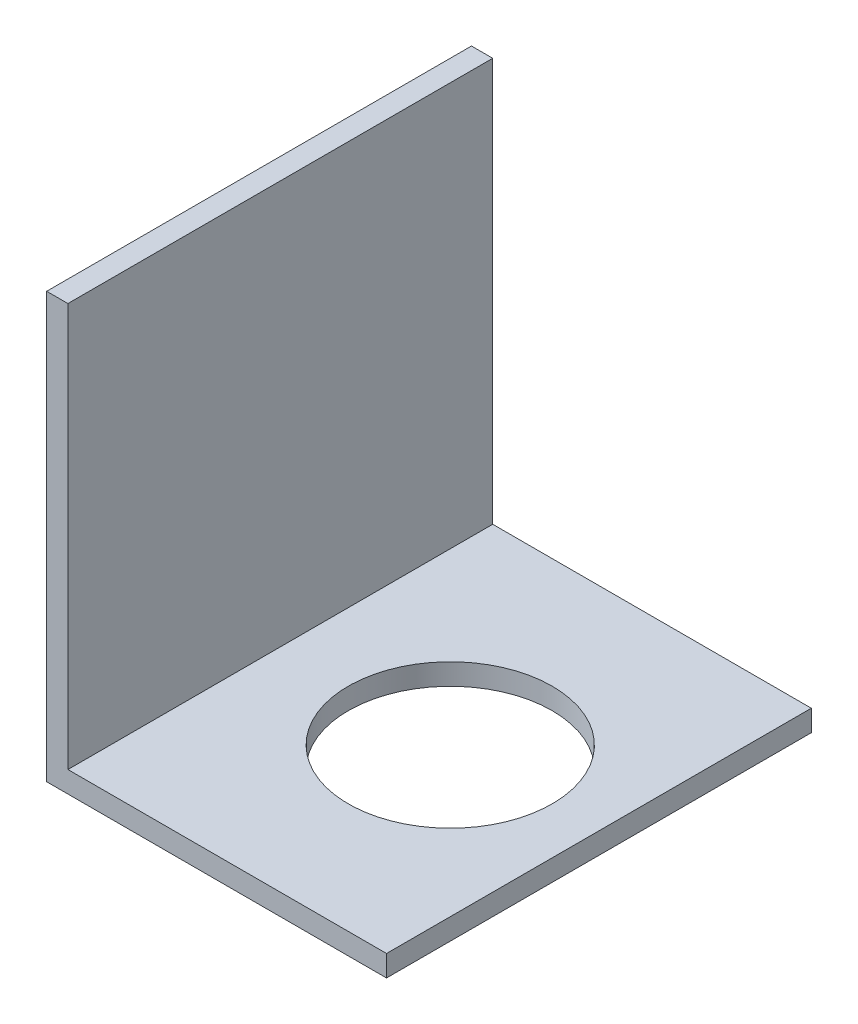
ISO-10303-21;
HEADER;
FILE_DESCRIPTION(('STEP AP214'),'2;1');
FILE_NAME('part.step','',(''),(''),'','','');
FILE_SCHEMA(('AUTOMOTIVE_DESIGN { 1 0 10303 214 1 1 1 1 }'));
ENDSEC;
DATA;
#1=APPLICATION_CONTEXT('core data for automotive mechanical design processes');
#2=APPLICATION_PROTOCOL_DEFINITION('international standard','automotive_design',2000,#1);
#3=PRODUCT_CONTEXT('',#1,'mechanical');
#4=PRODUCT('Part','Part','',(#3));
#5=PRODUCT_RELATED_PRODUCT_CATEGORY('part','',(#4));
#6=PRODUCT_DEFINITION_FORMATION('','',#4);
#7=PRODUCT_DEFINITION_CONTEXT('part definition',#1,'design');
#8=PRODUCT_DEFINITION('design','',#6,#7);
#9=PRODUCT_DEFINITION_SHAPE('','',#8);
#10=(LENGTH_UNIT() NAMED_UNIT(*) SI_UNIT(.MILLI.,.METRE.));
#11=(NAMED_UNIT(*) PLANE_ANGLE_UNIT() SI_UNIT($,.RADIAN.));
#12=(NAMED_UNIT(*) SI_UNIT($,.STERADIAN.) SOLID_ANGLE_UNIT());
#13=UNCERTAINTY_MEASURE_WITH_UNIT(LENGTH_MEASURE(1.E-05),#10,'distance_accuracy_value','');
#14=(GEOMETRIC_REPRESENTATION_CONTEXT(3) GLOBAL_UNCERTAINTY_ASSIGNED_CONTEXT((#13)) GLOBAL_UNIT_ASSIGNED_CONTEXT((#10,
#11,#12)) REPRESENTATION_CONTEXT('',''));
#15=CARTESIAN_POINT('',(0.,0.,0.));
#16=DIRECTION('',(0.,0.,1.));
#17=DIRECTION('',(1.,0.,0.));
#18=AXIS2_PLACEMENT_3D('',#15,#16,#17);
#19=CARTESIAN_POINT('',(45.,5.,0.));
#20=DIRECTION('',(0.,-1.,0.));
#21=DIRECTION('',(0.,0.,-1.));
#22=AXIS2_PLACEMENT_3D('',#19,#20,#21);
#23=CYLINDRICAL_SURFACE('',#22,24.);
#24=CARTESIAN_POINT('',(45.,5.,0.));
#25=DIRECTION('',(0.,-1.,0.));
#26=DIRECTION('',(0.,0.,-1.));
#27=AXIS2_PLACEMENT_3D('',#24,#25,#26);
#28=CIRCLE('',#27,24.);
#29=CARTESIAN_POINT('',(45.,5.,-24.));
#30=VERTEX_POINT('',#29);
#31=EDGE_CURVE('E20',#30,#30,#28,.T.);
#32=ORIENTED_EDGE('',*,*,#31,.F.);
#33=EDGE_LOOP('',(#32));
#34=FACE_BOUND('',#33,.T.);
#35=CARTESIAN_POINT('',(45.,0.,0.));
#36=DIRECTION('',(0.,-1.,0.));
#37=DIRECTION('',(0.,0.,-1.));
#38=AXIS2_PLACEMENT_3D('',#35,#36,#37);
#39=CIRCLE('',#38,24.);
#40=CARTESIAN_POINT('',(45.,0.,-24.));
#41=VERTEX_POINT('',#40);
#42=EDGE_CURVE('E81',#41,#41,#39,.F.);
#43=ORIENTED_EDGE('',*,*,#42,.F.);
#44=EDGE_LOOP('',(#43));
#45=FACE_BOUND('',#44,.T.);
#46=ADVANCED_FACE('F17',(#34,#45),#23,.F.);
#47=CARTESIAN_POINT('',(80.,0.,-50.));
#48=DIRECTION('',(1.,0.,0.));
#49=DIRECTION('',(0.,0.,-1.));
#50=AXIS2_PLACEMENT_3D('',#47,#48,#49);
#51=PLANE('',#50);
#52=DIRECTION('',(0.,0.,-1.));
#53=VECTOR('',#52,1.);
#54=CARTESIAN_POINT('',(80.,0.,-50.));
#55=LINE('',#54,#53);
#56=CARTESIAN_POINT('',(80.,0.,-50.));
#57=VERTEX_POINT('',#56);
#58=CARTESIAN_POINT('',(80.,0.,50.));
#59=VERTEX_POINT('',#58);
#60=EDGE_CURVE('E73',#57,#59,#55,.F.);
#61=ORIENTED_EDGE('',*,*,#60,.F.);
#62=DIRECTION('',(0.,1.,0.));
#63=VECTOR('',#62,1.);
#64=CARTESIAN_POINT('',(80.,0.,-50.));
#65=LINE('',#64,#63);
#66=CARTESIAN_POINT('',(80.,5.,-50.));
#67=VERTEX_POINT('',#66);
#68=EDGE_CURVE('E155',#57,#67,#65,.T.);
#69=ORIENTED_EDGE('',*,*,#68,.T.);
#70=DIRECTION('',(0.,0.,1.));
#71=VECTOR('',#70,1.);
#72=CARTESIAN_POINT('',(80.,5.,-50.));
#73=LINE('',#72,#71);
#74=CARTESIAN_POINT('',(80.,5.,50.));
#75=VERTEX_POINT('',#74);
#76=EDGE_CURVE('E68',#75,#67,#73,.F.);
#77=ORIENTED_EDGE('',*,*,#76,.F.);
#78=DIRECTION('',(0.,1.,0.));
#79=VECTOR('',#78,1.);
#80=CARTESIAN_POINT('',(80.,0.,50.));
#81=LINE('',#80,#79);
#82=EDGE_CURVE('E85',#59,#75,#81,.T.);
#83=ORIENTED_EDGE('',*,*,#82,.F.);
#84=EDGE_LOOP('',(#61,#69,#77,#83));
#85=FACE_BOUND('',#84,.T.);
#86=ADVANCED_FACE('F86',(#85),#51,.T.);
#87=CARTESIAN_POINT('',(80.,5.,-50.));
#88=DIRECTION('',(0.,1.,0.));
#89=DIRECTION('',(0.,0.,1.));
#90=AXIS2_PLACEMENT_3D('',#87,#88,#89);
#91=PLANE('',#90);
#92=ORIENTED_EDGE('',*,*,#31,.T.);
#93=EDGE_LOOP('',(#92));
#94=FACE_BOUND('',#93,.T.);
#95=ORIENTED_EDGE('',*,*,#76,.T.);
#96=DIRECTION('',(1.,0.,0.));
#97=VECTOR('',#96,1.);
#98=CARTESIAN_POINT('',(0.,5.,-50.));
#99=LINE('',#98,#97);
#100=CARTESIAN_POINT('',(5.,5.,-50.));
#101=VERTEX_POINT('',#100);
#102=EDGE_CURVE('E150',#67,#101,#99,.F.);
#103=ORIENTED_EDGE('',*,*,#102,.T.);
#104=DIRECTION('',(0.,0.,-1.));
#105=VECTOR('',#104,1.);
#106=CARTESIAN_POINT('',(5.,5.,-50.));
#107=LINE('',#106,#105);
#108=CARTESIAN_POINT('',(5.,5.,50.));
#109=VERTEX_POINT('',#108);
#110=EDGE_CURVE('E82',#109,#101,#107,.T.);
#111=ORIENTED_EDGE('',*,*,#110,.F.);
#112=DIRECTION('',(1.,0.,0.));
#113=VECTOR('',#112,1.);
#114=CARTESIAN_POINT('',(0.,5.,50.));
#115=LINE('',#114,#113);
#116=EDGE_CURVE('E89',#75,#109,#115,.F.);
#117=ORIENTED_EDGE('',*,*,#116,.F.);
#118=EDGE_LOOP('',(#95,#103,#111,#117));
#119=FACE_BOUND('',#118,.T.);
#120=ADVANCED_FACE('F106',(#94,#119),#91,.T.);
#121=CARTESIAN_POINT('',(5.,5.,-50.));
#122=DIRECTION('',(1.,0.,0.));
#123=DIRECTION('',(0.,0.,-1.));
#124=AXIS2_PLACEMENT_3D('',#121,#122,#123);
#125=PLANE('',#124);
#126=ORIENTED_EDGE('',*,*,#110,.T.);
#127=DIRECTION('',(0.,1.,0.));
#128=VECTOR('',#127,1.);
#129=CARTESIAN_POINT('',(5.,0.,-50.));
#130=LINE('',#129,#128);
#131=CARTESIAN_POINT('',(5.,100.,-50.));
#132=VERTEX_POINT('',#131);
#133=EDGE_CURVE('E146',#101,#132,#130,.T.);
#134=ORIENTED_EDGE('',*,*,#133,.T.);
#135=DIRECTION('',(0.,0.,1.));
#136=VECTOR('',#135,1.);
#137=CARTESIAN_POINT('',(5.,100.,-50.));
#138=LINE('',#137,#136);
#139=CARTESIAN_POINT('',(5.,100.,50.));
#140=VERTEX_POINT('',#139);
#141=EDGE_CURVE('E141',#140,#132,#138,.F.);
#142=ORIENTED_EDGE('',*,*,#141,.F.);
#143=DIRECTION('',(0.,1.,0.));
#144=VECTOR('',#143,1.);
#145=CARTESIAN_POINT('',(5.,0.,50.));
#146=LINE('',#145,#144);
#147=EDGE_CURVE('E159',#109,#140,#146,.T.);
#148=ORIENTED_EDGE('',*,*,#147,.F.);
#149=EDGE_LOOP('',(#126,#134,#142,#148));
#150=FACE_BOUND('',#149,.T.);
#151=ADVANCED_FACE('F113',(#150),#125,.T.);
#152=CARTESIAN_POINT('',(0.,0.,-50.));
#153=DIRECTION('',(0.,-1.,0.));
#154=DIRECTION('',(0.,0.,-1.));
#155=AXIS2_PLACEMENT_3D('',#152,#153,#154);
#156=PLANE('',#155);
#157=ORIENTED_EDGE('',*,*,#42,.T.);
#158=EDGE_LOOP('',(#157));
#159=FACE_BOUND('',#158,.T.);
#160=DIRECTION('',(0.,0.,1.));
#161=VECTOR('',#160,1.);
#162=CARTESIAN_POINT('',(0.,0.,-50.));
#163=LINE('',#162,#161);
#164=CARTESIAN_POINT('',(0.,0.,-50.));
#165=VERTEX_POINT('',#164);
#166=CARTESIAN_POINT('',(0.,0.,50.));
#167=VERTEX_POINT('',#166);
#168=EDGE_CURVE('E147',#165,#167,#163,.T.);
#169=ORIENTED_EDGE('',*,*,#168,.F.);
#170=DIRECTION('',(1.,0.,0.));
#171=VECTOR('',#170,1.);
#172=CARTESIAN_POINT('',(0.,0.,-50.));
#173=LINE('',#172,#171);
#174=EDGE_CURVE('E79',#165,#57,#173,.T.);
#175=ORIENTED_EDGE('',*,*,#174,.T.);
#176=ORIENTED_EDGE('',*,*,#60,.T.);
#177=DIRECTION('',(1.,0.,0.));
#178=VECTOR('',#177,1.);
#179=CARTESIAN_POINT('',(0.,0.,50.));
#180=LINE('',#179,#178);
#181=EDGE_CURVE('E76',#167,#59,#180,.T.);
#182=ORIENTED_EDGE('',*,*,#181,.F.);
#183=EDGE_LOOP('',(#169,#175,#176,#182));
#184=FACE_BOUND('',#183,.T.);
#185=ADVANCED_FACE('F74',(#159,#184),#156,.T.);
#186=CARTESIAN_POINT('',(0.,0.,50.));
#187=DIRECTION('',(0.,0.,1.));
#188=DIRECTION('',(1.,0.,0.));
#189=AXIS2_PLACEMENT_3D('',#186,#187,#188);
#190=PLANE('',#189);
#191=DIRECTION('',(1.,0.,0.));
#192=VECTOR('',#191,1.);
#193=CARTESIAN_POINT('',(5.,100.,50.));
#194=LINE('',#193,#192);
#195=CARTESIAN_POINT('',(0.,100.,50.));
#196=VERTEX_POINT('',#195);
#197=EDGE_CURVE('E142',#196,#140,#194,.T.);
#198=ORIENTED_EDGE('',*,*,#197,.F.);
#199=DIRECTION('',(0.,1.,0.));
#200=VECTOR('',#199,1.);
#201=CARTESIAN_POINT('',(0.,100.,50.));
#202=LINE('',#201,#200);
#203=EDGE_CURVE('E93',#167,#196,#202,.T.);
#204=ORIENTED_EDGE('',*,*,#203,.F.);
#205=ORIENTED_EDGE('',*,*,#181,.T.);
#206=ORIENTED_EDGE('',*,*,#82,.T.);
#207=ORIENTED_EDGE('',*,*,#116,.T.);
#208=ORIENTED_EDGE('',*,*,#147,.T.);
#209=EDGE_LOOP('',(#198,#204,#205,#206,#207,#208));
#210=FACE_BOUND('',#209,.T.);
#211=ADVANCED_FACE('F91',(#210),#190,.T.);
#212=CARTESIAN_POINT('',(5.,100.,-50.));
#213=DIRECTION('',(0.,1.,0.));
#214=DIRECTION('',(0.,0.,1.));
#215=AXIS2_PLACEMENT_3D('',#212,#213,#214);
#216=PLANE('',#215);
#217=ORIENTED_EDGE('',*,*,#141,.T.);
#218=DIRECTION('',(1.,0.,0.));
#219=VECTOR('',#218,1.);
#220=CARTESIAN_POINT('',(0.,100.,-50.));
#221=LINE('',#220,#219);
#222=CARTESIAN_POINT('',(0.,100.,-50.));
#223=VERTEX_POINT('',#222);
#224=EDGE_CURVE('E35',#132,#223,#221,.F.);
#225=ORIENTED_EDGE('',*,*,#224,.T.);
#226=DIRECTION('',(0.,0.,1.));
#227=VECTOR('',#226,1.);
#228=CARTESIAN_POINT('',(0.,100.,-50.));
#229=LINE('',#228,#227);
#230=EDGE_CURVE('E26',#196,#223,#229,.F.);
#231=ORIENTED_EDGE('',*,*,#230,.F.);
#232=ORIENTED_EDGE('',*,*,#197,.T.);
#233=EDGE_LOOP('',(#217,#225,#231,#232));
#234=FACE_BOUND('',#233,.T.);
#235=ADVANCED_FACE('F120',(#234),#216,.T.);
#236=CARTESIAN_POINT('',(0.,0.,-50.));
#237=DIRECTION('',(0.,0.,1.));
#238=DIRECTION('',(1.,0.,0.));
#239=AXIS2_PLACEMENT_3D('',#236,#237,#238);
#240=PLANE('',#239);
#241=ORIENTED_EDGE('',*,*,#133,.F.);
#242=ORIENTED_EDGE('',*,*,#102,.F.);
#243=ORIENTED_EDGE('',*,*,#68,.F.);
#244=ORIENTED_EDGE('',*,*,#174,.F.);
#245=DIRECTION('',(0.,1.,0.));
#246=VECTOR('',#245,1.);
#247=CARTESIAN_POINT('',(0.,100.,-50.));
#248=LINE('',#247,#246);
#249=EDGE_CURVE('E11',#223,#165,#248,.F.);
#250=ORIENTED_EDGE('',*,*,#249,.F.);
#251=ORIENTED_EDGE('',*,*,#224,.F.);
#252=EDGE_LOOP('',(#241,#242,#243,#244,#250,#251));
#253=FACE_BOUND('',#252,.T.);
#254=ADVANCED_FACE('F126',(#253),#240,.F.);
#255=CARTESIAN_POINT('',(0.,100.,-50.));
#256=DIRECTION('',(-1.,0.,0.));
#257=DIRECTION('',(0.,0.,1.));
#258=AXIS2_PLACEMENT_3D('',#255,#256,#257);
#259=PLANE('',#258);
#260=ORIENTED_EDGE('',*,*,#230,.T.);
#261=ORIENTED_EDGE('',*,*,#249,.T.);
#262=ORIENTED_EDGE('',*,*,#168,.T.);
#263=ORIENTED_EDGE('',*,*,#203,.T.);
#264=EDGE_LOOP('',(#260,#261,#262,#263));
#265=FACE_BOUND('',#264,.T.);
#266=ADVANCED_FACE('F124',(#265),#259,.T.);
#267=CLOSED_SHELL('',(#46,#86,#120,#151,#185,#211,#235,#254,#266));
#268=MANIFOLD_SOLID_BREP('B1',#267);
#269=ADVANCED_BREP_SHAPE_REPRESENTATION('',(#18,#268),#14);
#270=SHAPE_DEFINITION_REPRESENTATION(#9,#269);
ENDSEC;
END-ISO-10303-21;
